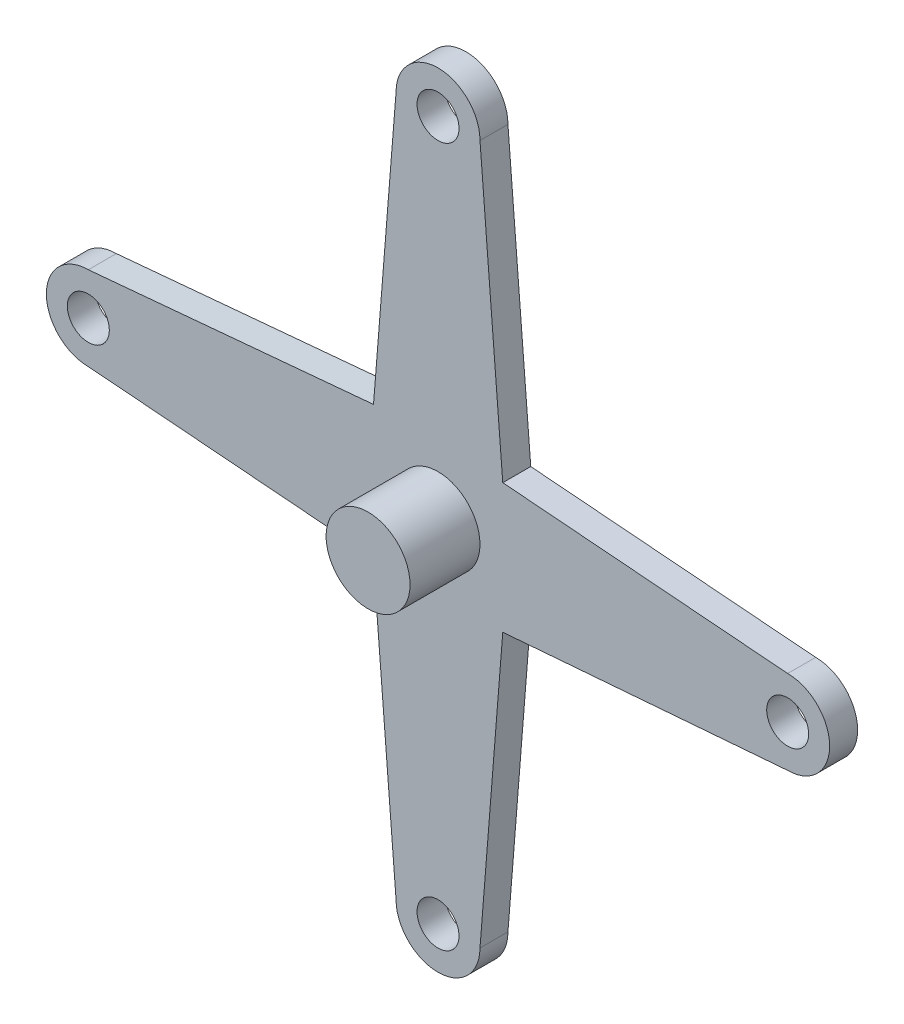
ISO-10303-21;
HEADER;
FILE_DESCRIPTION(('STEP AP214'),'2;1');
FILE_NAME('part.step','',(''),(''),'','','');
FILE_SCHEMA(('AUTOMOTIVE_DESIGN { 1 0 10303 214 1 1 1 1 }'));
ENDSEC;
DATA;
#1=APPLICATION_CONTEXT('core data for automotive mechanical design processes');
#2=APPLICATION_PROTOCOL_DEFINITION('international standard','automotive_design',2000,#1);
#3=PRODUCT_CONTEXT('',#1,'mechanical');
#4=PRODUCT('Part','Part','',(#3));
#5=PRODUCT_RELATED_PRODUCT_CATEGORY('part','',(#4));
#6=PRODUCT_DEFINITION_FORMATION('','',#4);
#7=PRODUCT_DEFINITION_CONTEXT('part definition',#1,'design');
#8=PRODUCT_DEFINITION('design','',#6,#7);
#9=PRODUCT_DEFINITION_SHAPE('','',#8);
#10=(LENGTH_UNIT() NAMED_UNIT(*) SI_UNIT(.MILLI.,.METRE.));
#11=(NAMED_UNIT(*) PLANE_ANGLE_UNIT() SI_UNIT($,.RADIAN.));
#12=(NAMED_UNIT(*) SI_UNIT($,.STERADIAN.) SOLID_ANGLE_UNIT());
#13=UNCERTAINTY_MEASURE_WITH_UNIT(LENGTH_MEASURE(1.E-05),#10,'distance_accuracy_value','');
#14=(GEOMETRIC_REPRESENTATION_CONTEXT(3) GLOBAL_UNCERTAINTY_ASSIGNED_CONTEXT((#13)) GLOBAL_UNIT_ASSIGNED_CONTEXT((#10,
#11,#12)) REPRESENTATION_CONTEXT('',''));
#15=CARTESIAN_POINT('',(0.,0.,0.));
#16=DIRECTION('',(0.,0.,1.));
#17=DIRECTION('',(1.,0.,0.));
#18=AXIS2_PLACEMENT_3D('',#15,#16,#17);
#19=CARTESIAN_POINT('',(0.,25.,2.));
#20=DIRECTION('',(0.,0.,1.));
#21=DIRECTION('',(1.,0.,0.));
#22=AXIS2_PLACEMENT_3D('',#19,#20,#21);
#23=PLANE('',#22);
#24=CARTESIAN_POINT('',(-25.,2.61861100413235E-13,2.));
#25=DIRECTION('',(0.,0.,1.));
#26=DIRECTION('',(1.,0.,0.));
#27=AXIS2_PLACEMENT_3D('',#24,#25,#26);
#28=CIRCLE('',#27,1.5);
#29=CARTESIAN_POINT('',(-23.5,2.61861100413235E-13,2.));
#30=VERTEX_POINT('',#29);
#31=EDGE_CURVE('E297',#30,#30,#28,.T.);
#32=ORIENTED_EDGE('',*,*,#31,.F.);
#33=EDGE_LOOP('',(#32));
#34=FACE_BOUND('',#33,.T.);
#35=CARTESIAN_POINT('',(25.,0.,2.));
#36=DIRECTION('',(0.,0.,1.));
#37=DIRECTION('',(1.,0.,0.));
#38=AXIS2_PLACEMENT_3D('',#35,#36,#37);
#39=CIRCLE('',#38,1.5);
#40=CARTESIAN_POINT('',(26.5,0.,2.));
#41=VERTEX_POINT('',#40);
#42=EDGE_CURVE('E311',#41,#41,#39,.T.);
#43=ORIENTED_EDGE('',*,*,#42,.F.);
#44=EDGE_LOOP('',(#43));
#45=FACE_BOUND('',#44,.T.);
#46=CARTESIAN_POINT('',(0.,25.,2.));
#47=DIRECTION('',(0.,0.,1.));
#48=DIRECTION('',(1.,0.,0.));
#49=AXIS2_PLACEMENT_3D('',#46,#47,#48);
#50=CIRCLE('',#49,3.);
#51=CARTESIAN_POINT('',(3.,25.,2.));
#52=VERTEX_POINT('',#51);
#53=CARTESIAN_POINT('',(-3.,25.,2.));
#54=VERTEX_POINT('',#53);
#55=EDGE_CURVE('E179',#52,#54,#50,.T.);
#56=ORIENTED_EDGE('',*,*,#55,.T.);
#57=DIRECTION('',(-0.0797452222828899,-0.996815278536125,0.));
#58=VECTOR('',#57,1.);
#59=CARTESIAN_POINT('',(-4.61154308633728,4.85571142078399,2.));
#60=LINE('',#59,#58);
#61=CARTESIAN_POINT('',(-4.61154308633728,4.85571142078399,2.));
#62=VERTEX_POINT('',#61);
#63=EDGE_CURVE('E107',#54,#62,#60,.T.);
#64=ORIENTED_EDGE('',*,*,#63,.T.);
#65=DIRECTION('',(-0.995883444119703,-0.0906430677342696,0.));
#66=VECTOR('',#65,1.);
#67=CARTESIAN_POINT('',(-4.61154308633728,4.85571142078399,2.));
#68=LINE('',#67,#66);
#69=CARTESIAN_POINT('',(-25.,3.00000000000026,2.));
#70=VERTEX_POINT('',#69);
#71=EDGE_CURVE('E206',#62,#70,#68,.T.);
#72=ORIENTED_EDGE('',*,*,#71,.T.);
#73=CARTESIAN_POINT('',(-25.,2.61861100413235E-13,2.));
#74=DIRECTION('',(0.,0.,1.));
#75=DIRECTION('',(1.,0.,0.));
#76=AXIS2_PLACEMENT_3D('',#73,#74,#75);
#77=CIRCLE('',#76,3.);
#78=CARTESIAN_POINT('',(-25.,-2.99999999999974,2.));
#79=VERTEX_POINT('',#78);
#80=EDGE_CURVE('E225',#70,#79,#77,.T.);
#81=ORIENTED_EDGE('',*,*,#80,.T.);
#82=DIRECTION('',(0.996815278536124,-0.0797452222829002,0.));
#83=VECTOR('',#82,1.);
#84=CARTESIAN_POINT('',(-4.62962962962967,-4.62962962962958,2.));
#85=LINE('',#84,#83);
#86=CARTESIAN_POINT('',(-4.62962962962967,-4.62962962962958,2.));
#87=VERTEX_POINT('',#86);
#88=EDGE_CURVE('E222',#79,#87,#85,.T.);
#89=ORIENTED_EDGE('',*,*,#88,.T.);
#90=DIRECTION('',(0.0797452222828832,-0.996815278536126,0.));
#91=VECTOR('',#90,1.);
#92=CARTESIAN_POINT('',(-4.62962962962967,-4.62962962962958,2.));
#93=LINE('',#92,#91);
#94=CARTESIAN_POINT('',(-3.00000000000017,-25.,2.));
#95=VERTEX_POINT('',#94);
#96=EDGE_CURVE('E224',#87,#95,#93,.T.);
#97=ORIENTED_EDGE('',*,*,#96,.T.);
#98=CARTESIAN_POINT('',(-1.74574066942157E-13,-25.,2.));
#99=DIRECTION('',(0.,0.,1.));
#100=DIRECTION('',(1.,0.,0.));
#101=AXIS2_PLACEMENT_3D('',#98,#99,#100);
#102=CIRCLE('',#101,3.);
#103=CARTESIAN_POINT('',(2.99999999999983,-25.,2.));
#104=VERTEX_POINT('',#103);
#105=EDGE_CURVE('E227',#95,#104,#102,.T.);
#106=ORIENTED_EDGE('',*,*,#105,.T.);
#107=DIRECTION('',(0.0797452222828969,0.996815278536125,0.));
#108=VECTOR('',#107,1.);
#109=CARTESIAN_POINT('',(4.6296296296296,-4.62962962962965,2.));
#110=LINE('',#109,#108);
#111=CARTESIAN_POINT('',(4.6296296296296,-4.62962962962965,2.));
#112=VERTEX_POINT('',#111);
#113=EDGE_CURVE('E233',#104,#112,#110,.T.);
#114=ORIENTED_EDGE('',*,*,#113,.T.);
#115=DIRECTION('',(0.996815278536125,0.0797452222828866,0.));
#116=VECTOR('',#115,1.);
#117=CARTESIAN_POINT('',(4.6296296296296,-4.62962962962965,2.));
#118=LINE('',#117,#116);
#119=CARTESIAN_POINT('',(25.,-3.00000000000009,2.));
#120=VERTEX_POINT('',#119);
#121=EDGE_CURVE('E138',#112,#120,#118,.T.);
#122=ORIENTED_EDGE('',*,*,#121,.T.);
#123=CARTESIAN_POINT('',(25.,0.,2.));
#124=DIRECTION('',(0.,0.,1.));
#125=DIRECTION('',(1.,0.,0.));
#126=AXIS2_PLACEMENT_3D('',#123,#124,#125);
#127=CIRCLE('',#126,3.);
#128=CARTESIAN_POINT('',(25.,2.99999999999991,2.));
#129=VERTEX_POINT('',#128);
#130=EDGE_CURVE('E132',#120,#129,#127,.T.);
#131=ORIENTED_EDGE('',*,*,#130,.T.);
#132=DIRECTION('',(-0.996815278536124,0.0797452222829012,0.));
#133=VECTOR('',#132,1.);
#134=CARTESIAN_POINT('',(4.62962962962946,4.62962962962979,2.));
#135=LINE('',#134,#133);
#136=CARTESIAN_POINT('',(4.62962962962946,4.62962962962979,2.));
#137=VERTEX_POINT('',#136);
#138=EDGE_CURVE('E136',#129,#137,#135,.T.);
#139=ORIENTED_EDGE('',*,*,#138,.T.);
#140=DIRECTION('',(-0.0797452222828822,0.996815278536126,0.));
#141=VECTOR('',#140,1.);
#142=CARTESIAN_POINT('',(4.62962962962946,4.62962962962979,2.));
#143=LINE('',#142,#141);
#144=EDGE_CURVE('E52',#137,#52,#143,.T.);
#145=ORIENTED_EDGE('',*,*,#144,.T.);
#146=EDGE_LOOP('',(#56,#64,#72,#81,#89,#97,#106,#114,#122,#131,#139,#145));
#147=FACE_BOUND('',#146,.T.);
#148=CARTESIAN_POINT('',(0.,25.,2.));
#149=DIRECTION('',(0.,0.,1.));
#150=DIRECTION('',(1.,0.,0.));
#151=AXIS2_PLACEMENT_3D('',#148,#149,#150);
#152=CIRCLE('',#151,1.5);
#153=CARTESIAN_POINT('',(1.5,25.,2.));
#154=VERTEX_POINT('',#153);
#155=EDGE_CURVE('E160',#154,#154,#152,.T.);
#156=ORIENTED_EDGE('',*,*,#155,.F.);
#157=EDGE_LOOP('',(#156));
#158=FACE_BOUND('',#157,.T.);
#159=CARTESIAN_POINT('',(-1.74574066942157E-13,-25.,2.));
#160=DIRECTION('',(0.,0.,1.));
#161=DIRECTION('',(1.,0.,0.));
#162=AXIS2_PLACEMENT_3D('',#159,#160,#161);
#163=CIRCLE('',#162,1.5);
#164=CARTESIAN_POINT('',(1.49999999999983,-25.,2.));
#165=VERTEX_POINT('',#164);
#166=EDGE_CURVE('E305',#165,#165,#163,.T.);
#167=ORIENTED_EDGE('',*,*,#166,.F.);
#168=EDGE_LOOP('',(#167));
#169=FACE_BOUND('',#168,.T.);
#170=CARTESIAN_POINT('',(0.,0.,2.));
#171=DIRECTION('',(0.,0.,1.));
#172=DIRECTION('',(1.,0.,0.));
#173=AXIS2_PLACEMENT_3D('',#170,#171,#172);
#174=CIRCLE('',#173,3.);
#175=CARTESIAN_POINT('',(3.,0.,2.));
#176=VERTEX_POINT('',#175);
#177=EDGE_CURVE('E294',#176,#176,#174,.T.);
#178=ORIENTED_EDGE('',*,*,#177,.F.);
#179=EDGE_LOOP('',(#178));
#180=FACE_BOUND('',#179,.T.);
#181=ADVANCED_FACE('F35',(#34,#45,#147,#158,#169,#180),#23,.T.);
#182=CARTESIAN_POINT('',(0.,25.,0.));
#183=DIRECTION('',(0.,0.,1.));
#184=DIRECTION('',(1.,0.,0.));
#185=AXIS2_PLACEMENT_3D('',#182,#183,#184);
#186=PLANE('',#185);
#187=CARTESIAN_POINT('',(-1.74574066942157E-13,-25.,0.));
#188=DIRECTION('',(0.,0.,1.));
#189=DIRECTION('',(1.,0.,0.));
#190=AXIS2_PLACEMENT_3D('',#187,#188,#189);
#191=CIRCLE('',#190,1.5);
#192=CARTESIAN_POINT('',(1.49999999999983,-25.,0.));
#193=VERTEX_POINT('',#192);
#194=EDGE_CURVE('E303',#193,#193,#191,.T.);
#195=ORIENTED_EDGE('',*,*,#194,.T.);
#196=EDGE_LOOP('',(#195));
#197=FACE_BOUND('',#196,.T.);
#198=CARTESIAN_POINT('',(0.,25.,0.));
#199=DIRECTION('',(0.,0.,1.));
#200=DIRECTION('',(1.,0.,0.));
#201=AXIS2_PLACEMENT_3D('',#198,#199,#200);
#202=CIRCLE('',#201,1.5);
#203=CARTESIAN_POINT('',(1.5,25.,0.));
#204=VERTEX_POINT('',#203);
#205=EDGE_CURVE('E314',#204,#204,#202,.T.);
#206=ORIENTED_EDGE('',*,*,#205,.T.);
#207=EDGE_LOOP('',(#206));
#208=FACE_BOUND('',#207,.T.);
#209=CARTESIAN_POINT('',(0.,25.,0.));
#210=DIRECTION('',(0.,0.,1.));
#211=DIRECTION('',(1.,0.,0.));
#212=AXIS2_PLACEMENT_3D('',#209,#210,#211);
#213=CIRCLE('',#212,3.);
#214=CARTESIAN_POINT('',(3.,25.,0.));
#215=VERTEX_POINT('',#214);
#216=CARTESIAN_POINT('',(-3.,25.,0.));
#217=VERTEX_POINT('',#216);
#218=EDGE_CURVE('E156',#215,#217,#213,.T.);
#219=ORIENTED_EDGE('',*,*,#218,.F.);
#220=DIRECTION('',(-0.0797452222828822,0.996815278536126,0.));
#221=VECTOR('',#220,1.);
#222=CARTESIAN_POINT('',(4.62962962962946,4.62962962962979,0.));
#223=LINE('',#222,#221);
#224=CARTESIAN_POINT('',(4.62962962962946,4.62962962962979,0.));
#225=VERTEX_POINT('',#224);
#226=EDGE_CURVE('E99',#225,#215,#223,.T.);
#227=ORIENTED_EDGE('',*,*,#226,.F.);
#228=DIRECTION('',(-0.996815278536124,0.0797452222829012,0.));
#229=VECTOR('',#228,1.);
#230=CARTESIAN_POINT('',(4.62962962962946,4.62962962962979,0.));
#231=LINE('',#230,#229);
#232=CARTESIAN_POINT('',(25.,2.99999999999991,0.));
#233=VERTEX_POINT('',#232);
#234=EDGE_CURVE('E93',#233,#225,#231,.T.);
#235=ORIENTED_EDGE('',*,*,#234,.F.);
#236=CARTESIAN_POINT('',(25.,0.,0.));
#237=DIRECTION('',(0.,0.,1.));
#238=DIRECTION('',(1.,0.,0.));
#239=AXIS2_PLACEMENT_3D('',#236,#237,#238);
#240=CIRCLE('',#239,3.);
#241=CARTESIAN_POINT('',(25.,-3.00000000000009,0.));
#242=VERTEX_POINT('',#241);
#243=EDGE_CURVE('E146',#242,#233,#240,.T.);
#244=ORIENTED_EDGE('',*,*,#243,.F.);
#245=DIRECTION('',(0.996815278536125,0.0797452222828866,0.));
#246=VECTOR('',#245,1.);
#247=CARTESIAN_POINT('',(4.6296296296296,-4.62962962962965,0.));
#248=LINE('',#247,#246);
#249=CARTESIAN_POINT('',(4.6296296296296,-4.62962962962965,0.));
#250=VERTEX_POINT('',#249);
#251=EDGE_CURVE('E174',#250,#242,#248,.T.);
#252=ORIENTED_EDGE('',*,*,#251,.F.);
#253=DIRECTION('',(0.0797452222828969,0.996815278536125,0.));
#254=VECTOR('',#253,1.);
#255=CARTESIAN_POINT('',(4.6296296296296,-4.62962962962965,0.));
#256=LINE('',#255,#254);
#257=CARTESIAN_POINT('',(2.99999999999983,-25.,0.));
#258=VERTEX_POINT('',#257);
#259=EDGE_CURVE('E172',#258,#250,#256,.T.);
#260=ORIENTED_EDGE('',*,*,#259,.F.);
#261=CARTESIAN_POINT('',(-1.74574066942157E-13,-25.,0.));
#262=DIRECTION('',(0.,0.,1.));
#263=DIRECTION('',(1.,0.,0.));
#264=AXIS2_PLACEMENT_3D('',#261,#262,#263);
#265=CIRCLE('',#264,3.);
#266=CARTESIAN_POINT('',(-3.00000000000017,-25.,0.));
#267=VERTEX_POINT('',#266);
#268=EDGE_CURVE('E170',#267,#258,#265,.T.);
#269=ORIENTED_EDGE('',*,*,#268,.F.);
#270=DIRECTION('',(0.0797452222828832,-0.996815278536126,0.));
#271=VECTOR('',#270,1.);
#272=CARTESIAN_POINT('',(-4.62962962962967,-4.62962962962958,0.));
#273=LINE('',#272,#271);
#274=CARTESIAN_POINT('',(-4.62962962962967,-4.62962962962958,0.));
#275=VERTEX_POINT('',#274);
#276=EDGE_CURVE('E168',#275,#267,#273,.T.);
#277=ORIENTED_EDGE('',*,*,#276,.F.);
#278=DIRECTION('',(0.996815278536124,-0.0797452222829002,0.));
#279=VECTOR('',#278,1.);
#280=CARTESIAN_POINT('',(-4.62962962962967,-4.62962962962958,0.));
#281=LINE('',#280,#279);
#282=CARTESIAN_POINT('',(-25.,-2.99999999999974,0.));
#283=VERTEX_POINT('',#282);
#284=EDGE_CURVE('E166',#283,#275,#281,.T.);
#285=ORIENTED_EDGE('',*,*,#284,.F.);
#286=CARTESIAN_POINT('',(-25.,2.61861100413235E-13,0.));
#287=DIRECTION('',(0.,0.,1.));
#288=DIRECTION('',(1.,0.,0.));
#289=AXIS2_PLACEMENT_3D('',#286,#287,#288);
#290=CIRCLE('',#289,3.);
#291=CARTESIAN_POINT('',(-25.,3.00000000000026,0.));
#292=VERTEX_POINT('',#291);
#293=EDGE_CURVE('E164',#292,#283,#290,.T.);
#294=ORIENTED_EDGE('',*,*,#293,.F.);
#295=DIRECTION('',(-0.995883444119703,-0.0906430677342696,0.));
#296=VECTOR('',#295,1.);
#297=CARTESIAN_POINT('',(-4.61154308633728,4.85571142078399,0.));
#298=LINE('',#297,#296);
#299=CARTESIAN_POINT('',(-4.61154308633728,4.85571142078399,0.));
#300=VERTEX_POINT('',#299);
#301=EDGE_CURVE('E162',#300,#292,#298,.T.);
#302=ORIENTED_EDGE('',*,*,#301,.F.);
#303=DIRECTION('',(-0.0797452222828899,-0.996815278536125,0.));
#304=VECTOR('',#303,1.);
#305=CARTESIAN_POINT('',(-4.61154308633728,4.85571142078399,0.));
#306=LINE('',#305,#304);
#307=EDGE_CURVE('E159',#217,#300,#306,.T.);
#308=ORIENTED_EDGE('',*,*,#307,.F.);
#309=EDGE_LOOP('',(#219,#227,#235,#244,#252,#260,#269,#277,#285,#294,#302,#308));
#310=FACE_BOUND('',#309,.T.);
#311=CARTESIAN_POINT('',(25.,0.,0.));
#312=DIRECTION('',(0.,0.,1.));
#313=DIRECTION('',(1.,0.,0.));
#314=AXIS2_PLACEMENT_3D('',#311,#312,#313);
#315=CIRCLE('',#314,1.5);
#316=CARTESIAN_POINT('',(26.5,0.,0.));
#317=VERTEX_POINT('',#316);
#318=EDGE_CURVE('E308',#317,#317,#315,.T.);
#319=ORIENTED_EDGE('',*,*,#318,.T.);
#320=EDGE_LOOP('',(#319));
#321=FACE_BOUND('',#320,.T.);
#322=CARTESIAN_POINT('',(-25.,2.61861100413235E-13,0.));
#323=DIRECTION('',(0.,0.,1.));
#324=DIRECTION('',(1.,0.,0.));
#325=AXIS2_PLACEMENT_3D('',#322,#323,#324);
#326=CIRCLE('',#325,1.5);
#327=CARTESIAN_POINT('',(-23.5,2.61861100413235E-13,0.));
#328=VERTEX_POINT('',#327);
#329=EDGE_CURVE('E293',#328,#328,#326,.T.);
#330=ORIENTED_EDGE('',*,*,#329,.T.);
#331=EDGE_LOOP('',(#330));
#332=FACE_BOUND('',#331,.T.);
#333=ADVANCED_FACE('F210',(#197,#208,#310,#321,#332),#186,.F.);
#334=CARTESIAN_POINT('',(0.,25.,2.));
#335=DIRECTION('',(0.,0.,-1.));
#336=DIRECTION('',(-1.,0.,0.));
#337=AXIS2_PLACEMENT_3D('',#334,#335,#336);
#338=CYLINDRICAL_SURFACE('',#337,3.);
#339=ORIENTED_EDGE('',*,*,#218,.T.);
#340=DIRECTION('',(0.,0.,-1.));
#341=VECTOR('',#340,1.);
#342=CARTESIAN_POINT('',(-3.,25.,2.));
#343=LINE('',#342,#341);
#344=EDGE_CURVE('E11',#54,#217,#343,.T.);
#345=ORIENTED_EDGE('',*,*,#344,.F.);
#346=ORIENTED_EDGE('',*,*,#55,.F.);
#347=DIRECTION('',(0.,0.,-1.));
#348=VECTOR('',#347,1.);
#349=CARTESIAN_POINT('',(3.,25.,2.));
#350=LINE('',#349,#348);
#351=EDGE_CURVE('E152',#52,#215,#350,.T.);
#352=ORIENTED_EDGE('',*,*,#351,.T.);
#353=EDGE_LOOP('',(#339,#345,#346,#352));
#354=FACE_BOUND('',#353,.T.);
#355=ADVANCED_FACE('F37',(#354),#338,.T.);
#356=CARTESIAN_POINT('',(-4.61154308633728,4.85571142078399,2.));
#357=DIRECTION('',(0.996815278536125,-0.0797452222828899,0.));
#358=DIRECTION('',(0.0797452222828899,0.996815278536125,0.));
#359=AXIS2_PLACEMENT_3D('',#356,#357,#358);
#360=PLANE('',#359);
#361=ORIENTED_EDGE('',*,*,#307,.T.);
#362=DIRECTION('',(0.,0.,-1.));
#363=VECTOR('',#362,1.);
#364=CARTESIAN_POINT('',(-4.61154308633728,4.85571142078399,2.));
#365=LINE('',#364,#363);
#366=EDGE_CURVE('E44',#62,#300,#365,.T.);
#367=ORIENTED_EDGE('',*,*,#366,.F.);
#368=ORIENTED_EDGE('',*,*,#63,.F.);
#369=ORIENTED_EDGE('',*,*,#344,.T.);
#370=EDGE_LOOP('',(#361,#367,#368,#369));
#371=FACE_BOUND('',#370,.T.);
#372=ADVANCED_FACE('F438',(#371),#360,.F.);
#373=CARTESIAN_POINT('',(-4.61154308633728,4.85571142078399,2.));
#374=DIRECTION('',(0.0906430677342696,-0.995883444119703,0.));
#375=DIRECTION('',(0.995883444119703,0.0906430677342696,0.));
#376=AXIS2_PLACEMENT_3D('',#373,#374,#375);
#377=PLANE('',#376);
#378=ORIENTED_EDGE('',*,*,#301,.T.);
#379=DIRECTION('',(0.,0.,-1.));
#380=VECTOR('',#379,1.);
#381=CARTESIAN_POINT('',(-25.,3.00000000000026,2.));
#382=LINE('',#381,#380);
#383=EDGE_CURVE('E198',#70,#292,#382,.T.);
#384=ORIENTED_EDGE('',*,*,#383,.F.);
#385=ORIENTED_EDGE('',*,*,#71,.F.);
#386=ORIENTED_EDGE('',*,*,#366,.T.);
#387=EDGE_LOOP('',(#378,#384,#385,#386));
#388=FACE_BOUND('',#387,.T.);
#389=ADVANCED_FACE('F204',(#388),#377,.F.);
#390=CARTESIAN_POINT('',(-25.,2.61861100413235E-13,2.));
#391=DIRECTION('',(0.,0.,-1.));
#392=DIRECTION('',(-1.,0.,0.));
#393=AXIS2_PLACEMENT_3D('',#390,#391,#392);
#394=CYLINDRICAL_SURFACE('',#393,3.);
#395=ORIENTED_EDGE('',*,*,#293,.T.);
#396=DIRECTION('',(0.,0.,-1.));
#397=VECTOR('',#396,1.);
#398=CARTESIAN_POINT('',(-25.,-2.99999999999974,2.));
#399=LINE('',#398,#397);
#400=EDGE_CURVE('E195',#79,#283,#399,.T.);
#401=ORIENTED_EDGE('',*,*,#400,.F.);
#402=ORIENTED_EDGE('',*,*,#80,.F.);
#403=ORIENTED_EDGE('',*,*,#383,.T.);
#404=EDGE_LOOP('',(#395,#401,#402,#403));
#405=FACE_BOUND('',#404,.T.);
#406=ADVANCED_FACE('F216',(#405),#394,.T.);
#407=CARTESIAN_POINT('',(-4.62962962962967,-4.62962962962958,2.));
#408=DIRECTION('',(0.0797452222829002,0.996815278536124,0.));
#409=DIRECTION('',(-0.996815278536124,0.0797452222829002,0.));
#410=AXIS2_PLACEMENT_3D('',#407,#408,#409);
#411=PLANE('',#410);
#412=ORIENTED_EDGE('',*,*,#284,.T.);
#413=DIRECTION('',(0.,0.,-1.));
#414=VECTOR('',#413,1.);
#415=CARTESIAN_POINT('',(-4.62962962962967,-4.62962962962958,2.));
#416=LINE('',#415,#414);
#417=EDGE_CURVE('E192',#87,#275,#416,.T.);
#418=ORIENTED_EDGE('',*,*,#417,.F.);
#419=ORIENTED_EDGE('',*,*,#88,.F.);
#420=ORIENTED_EDGE('',*,*,#400,.T.);
#421=EDGE_LOOP('',(#412,#418,#419,#420));
#422=FACE_BOUND('',#421,.T.);
#423=ADVANCED_FACE('F220',(#422),#411,.F.);
#424=CARTESIAN_POINT('',(-4.62962962962967,-4.62962962962958,2.));
#425=DIRECTION('',(0.996815278536126,0.0797452222828832,0.));
#426=DIRECTION('',(-0.0797452222828832,0.996815278536126,0.));
#427=AXIS2_PLACEMENT_3D('',#424,#425,#426);
#428=PLANE('',#427);
#429=ORIENTED_EDGE('',*,*,#276,.T.);
#430=DIRECTION('',(0.,0.,-1.));
#431=VECTOR('',#430,1.);
#432=CARTESIAN_POINT('',(-3.00000000000017,-25.,2.));
#433=LINE('',#432,#431);
#434=EDGE_CURVE('E189',#95,#267,#433,.T.);
#435=ORIENTED_EDGE('',*,*,#434,.F.);
#436=ORIENTED_EDGE('',*,*,#96,.F.);
#437=ORIENTED_EDGE('',*,*,#417,.T.);
#438=EDGE_LOOP('',(#429,#435,#436,#437));
#439=FACE_BOUND('',#438,.T.);
#440=ADVANCED_FACE('F403',(#439),#428,.F.);
#441=CARTESIAN_POINT('',(-1.74574066942157E-13,-25.,2.));
#442=DIRECTION('',(0.,0.,-1.));
#443=DIRECTION('',(-1.,0.,0.));
#444=AXIS2_PLACEMENT_3D('',#441,#442,#443);
#445=CYLINDRICAL_SURFACE('',#444,3.);
#446=ORIENTED_EDGE('',*,*,#268,.T.);
#447=DIRECTION('',(0.,0.,-1.));
#448=VECTOR('',#447,1.);
#449=CARTESIAN_POINT('',(2.99999999999983,-25.,2.));
#450=LINE('',#449,#448);
#451=EDGE_CURVE('E186',#104,#258,#450,.T.);
#452=ORIENTED_EDGE('',*,*,#451,.F.);
#453=ORIENTED_EDGE('',*,*,#105,.F.);
#454=ORIENTED_EDGE('',*,*,#434,.T.);
#455=EDGE_LOOP('',(#446,#452,#453,#454));
#456=FACE_BOUND('',#455,.T.);
#457=ADVANCED_FACE('F394',(#456),#445,.T.);
#458=CARTESIAN_POINT('',(4.6296296296296,-4.62962962962965,2.));
#459=DIRECTION('',(-0.996815278536125,0.0797452222828969,0.));
#460=DIRECTION('',(-0.0797452222828969,-0.996815278536125,0.));
#461=AXIS2_PLACEMENT_3D('',#458,#459,#460);
#462=PLANE('',#461);
#463=ORIENTED_EDGE('',*,*,#259,.T.);
#464=DIRECTION('',(0.,0.,-1.));
#465=VECTOR('',#464,1.);
#466=CARTESIAN_POINT('',(4.6296296296296,-4.62962962962965,2.));
#467=LINE('',#466,#465);
#468=EDGE_CURVE('E183',#112,#250,#467,.T.);
#469=ORIENTED_EDGE('',*,*,#468,.F.);
#470=ORIENTED_EDGE('',*,*,#113,.F.);
#471=ORIENTED_EDGE('',*,*,#451,.T.);
#472=EDGE_LOOP('',(#463,#469,#470,#471));
#473=FACE_BOUND('',#472,.T.);
#474=ADVANCED_FACE('F239',(#473),#462,.F.);
#475=CARTESIAN_POINT('',(4.6296296296296,-4.62962962962965,2.));
#476=DIRECTION('',(-0.0797452222828866,0.996815278536125,0.));
#477=DIRECTION('',(-0.996815278536125,-0.0797452222828866,0.));
#478=AXIS2_PLACEMENT_3D('',#475,#476,#477);
#479=PLANE('',#478);
#480=ORIENTED_EDGE('',*,*,#251,.T.);
#481=DIRECTION('',(0.,0.,-1.));
#482=VECTOR('',#481,1.);
#483=CARTESIAN_POINT('',(25.,-3.00000000000009,2.));
#484=LINE('',#483,#482);
#485=EDGE_CURVE('E147',#120,#242,#484,.T.);
#486=ORIENTED_EDGE('',*,*,#485,.F.);
#487=ORIENTED_EDGE('',*,*,#121,.F.);
#488=ORIENTED_EDGE('',*,*,#468,.T.);
#489=EDGE_LOOP('',(#480,#486,#487,#488));
#490=FACE_BOUND('',#489,.T.);
#491=ADVANCED_FACE('F243',(#490),#479,.F.);
#492=CARTESIAN_POINT('',(25.,0.,2.));
#493=DIRECTION('',(0.,0.,-1.));
#494=DIRECTION('',(-1.,0.,0.));
#495=AXIS2_PLACEMENT_3D('',#492,#493,#494);
#496=CYLINDRICAL_SURFACE('',#495,3.);
#497=ORIENTED_EDGE('',*,*,#243,.T.);
#498=DIRECTION('',(0.,0.,-1.));
#499=VECTOR('',#498,1.);
#500=CARTESIAN_POINT('',(25.,2.99999999999991,2.));
#501=LINE('',#500,#499);
#502=EDGE_CURVE('E143',#129,#233,#501,.T.);
#503=ORIENTED_EDGE('',*,*,#502,.F.);
#504=ORIENTED_EDGE('',*,*,#130,.F.);
#505=ORIENTED_EDGE('',*,*,#485,.T.);
#506=EDGE_LOOP('',(#497,#503,#504,#505));
#507=FACE_BOUND('',#506,.T.);
#508=ADVANCED_FACE('F144',(#507),#496,.T.);
#509=CARTESIAN_POINT('',(4.62962962962946,4.62962962962979,2.));
#510=DIRECTION('',(-0.0797452222829012,-0.996815278536124,0.));
#511=DIRECTION('',(0.996815278536124,-0.0797452222829012,0.));
#512=AXIS2_PLACEMENT_3D('',#509,#510,#511);
#513=PLANE('',#512);
#514=ORIENTED_EDGE('',*,*,#234,.T.);
#515=DIRECTION('',(0.,0.,-1.));
#516=VECTOR('',#515,1.);
#517=CARTESIAN_POINT('',(4.62962962962946,4.62962962962979,2.));
#518=LINE('',#517,#516);
#519=EDGE_CURVE('E148',#137,#225,#518,.T.);
#520=ORIENTED_EDGE('',*,*,#519,.F.);
#521=ORIENTED_EDGE('',*,*,#138,.F.);
#522=ORIENTED_EDGE('',*,*,#502,.T.);
#523=EDGE_LOOP('',(#514,#520,#521,#522));
#524=FACE_BOUND('',#523,.T.);
#525=ADVANCED_FACE('F150',(#524),#513,.F.);
#526=CARTESIAN_POINT('',(4.62962962962946,4.62962962962979,2.));
#527=DIRECTION('',(-0.996815278536126,-0.0797452222828822,0.));
#528=DIRECTION('',(0.0797452222828822,-0.996815278536126,0.));
#529=AXIS2_PLACEMENT_3D('',#526,#527,#528);
#530=PLANE('',#529);
#531=ORIENTED_EDGE('',*,*,#226,.T.);
#532=ORIENTED_EDGE('',*,*,#351,.F.);
#533=ORIENTED_EDGE('',*,*,#144,.F.);
#534=ORIENTED_EDGE('',*,*,#519,.T.);
#535=EDGE_LOOP('',(#531,#532,#533,#534));
#536=FACE_BOUND('',#535,.T.);
#537=ADVANCED_FACE('F247',(#536),#530,.F.);
#538=CARTESIAN_POINT('',(0.,25.,2.));
#539=DIRECTION('',(0.,0.,-1.));
#540=DIRECTION('',(-1.,0.,0.));
#541=AXIS2_PLACEMENT_3D('',#538,#539,#540);
#542=CYLINDRICAL_SURFACE('',#541,1.5);
#543=ORIENTED_EDGE('',*,*,#155,.T.);
#544=EDGE_LOOP('',(#543));
#545=FACE_BOUND('',#544,.T.);
#546=ORIENTED_EDGE('',*,*,#205,.F.);
#547=EDGE_LOOP('',(#546));
#548=FACE_BOUND('',#547,.T.);
#549=ADVANCED_FACE('F249',(#545,#548),#542,.F.);
#550=CARTESIAN_POINT('',(25.,0.,2.));
#551=DIRECTION('',(0.,0.,-1.));
#552=DIRECTION('',(-1.,0.,0.));
#553=AXIS2_PLACEMENT_3D('',#550,#551,#552);
#554=CYLINDRICAL_SURFACE('',#553,1.5);
#555=ORIENTED_EDGE('',*,*,#42,.T.);
#556=EDGE_LOOP('',(#555));
#557=FACE_BOUND('',#556,.T.);
#558=ORIENTED_EDGE('',*,*,#318,.F.);
#559=EDGE_LOOP('',(#558));
#560=FACE_BOUND('',#559,.T.);
#561=ADVANCED_FACE('F255',(#557,#560),#554,.F.);
#562=CARTESIAN_POINT('',(-1.74574066942157E-13,-25.,2.));
#563=DIRECTION('',(0.,0.,-1.));
#564=DIRECTION('',(-1.,0.,0.));
#565=AXIS2_PLACEMENT_3D('',#562,#563,#564);
#566=CYLINDRICAL_SURFACE('',#565,1.5);
#567=ORIENTED_EDGE('',*,*,#166,.T.);
#568=EDGE_LOOP('',(#567));
#569=FACE_BOUND('',#568,.T.);
#570=ORIENTED_EDGE('',*,*,#194,.F.);
#571=EDGE_LOOP('',(#570));
#572=FACE_BOUND('',#571,.T.);
#573=ADVANCED_FACE('F272',(#569,#572),#566,.F.);
#574=CARTESIAN_POINT('',(-25.,2.61861100413235E-13,2.));
#575=DIRECTION('',(0.,0.,-1.));
#576=DIRECTION('',(-1.,0.,0.));
#577=AXIS2_PLACEMENT_3D('',#574,#575,#576);
#578=CYLINDRICAL_SURFACE('',#577,1.5);
#579=ORIENTED_EDGE('',*,*,#31,.T.);
#580=EDGE_LOOP('',(#579));
#581=FACE_BOUND('',#580,.T.);
#582=ORIENTED_EDGE('',*,*,#329,.F.);
#583=EDGE_LOOP('',(#582));
#584=FACE_BOUND('',#583,.T.);
#585=ADVANCED_FACE('F276',(#581,#584),#578,.F.);
#586=CARTESIAN_POINT('',(0.,0.,7.));
#587=DIRECTION('',(0.,0.,-1.));
#588=DIRECTION('',(-1.,0.,0.));
#589=AXIS2_PLACEMENT_3D('',#586,#587,#588);
#590=CYLINDRICAL_SURFACE('',#589,3.);
#591=CARTESIAN_POINT('',(0.,0.,7.));
#592=DIRECTION('',(0.,0.,1.));
#593=DIRECTION('',(1.,0.,0.));
#594=AXIS2_PLACEMENT_3D('',#591,#592,#593);
#595=CIRCLE('',#594,3.);
#596=CARTESIAN_POINT('',(3.,0.,7.));
#597=VERTEX_POINT('',#596);
#598=EDGE_CURVE('E292',#597,#597,#595,.T.);
#599=ORIENTED_EDGE('',*,*,#598,.F.);
#600=EDGE_LOOP('',(#599));
#601=FACE_BOUND('',#600,.T.);
#602=ORIENTED_EDGE('',*,*,#177,.T.);
#603=EDGE_LOOP('',(#602));
#604=FACE_BOUND('',#603,.T.);
#605=ADVANCED_FACE('F280',(#601,#604),#590,.T.);
#606=CARTESIAN_POINT('',(0.,0.,7.));
#607=DIRECTION('',(0.,0.,1.));
#608=DIRECTION('',(1.,0.,0.));
#609=AXIS2_PLACEMENT_3D('',#606,#607,#608);
#610=PLANE('',#609);
#611=ORIENTED_EDGE('',*,*,#598,.T.);
#612=EDGE_LOOP('',(#611));
#613=FACE_BOUND('',#612,.T.);
#614=ADVANCED_FACE('F284',(#613),#610,.T.);
#615=CLOSED_SHELL('',(#181,#333,#355,#372,#389,#406,#423,#440,#457,#474,#491,#508,#525,#537,
#549,#561,#573,#585,#605,#614));
#616=MANIFOLD_SOLID_BREP('B2',#615);
#617=ADVANCED_BREP_SHAPE_REPRESENTATION('',(#18,#616),#14);
#618=SHAPE_DEFINITION_REPRESENTATION(#9,#617);
ENDSEC;
END-ISO-10303-21;
